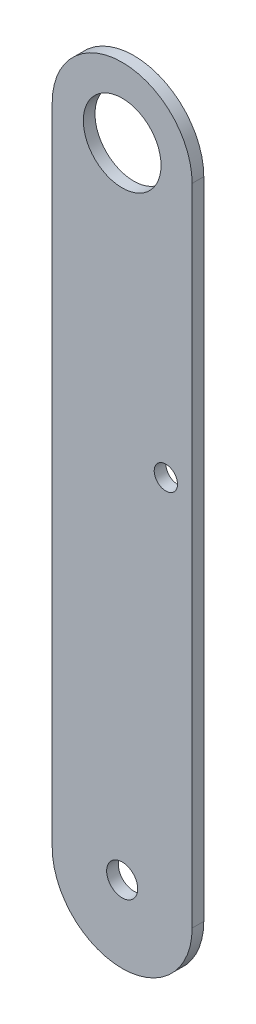
ISO-10303-21;
HEADER;
FILE_DESCRIPTION(('STEP AP214'),'2;1');
FILE_NAME('part.step','',(''),(''),'','','');
FILE_SCHEMA(('AUTOMOTIVE_DESIGN { 1 0 10303 214 1 1 1 1 }'));
ENDSEC;
DATA;
#1=APPLICATION_CONTEXT('core data for automotive mechanical design processes');
#2=APPLICATION_PROTOCOL_DEFINITION('international standard','automotive_design',2000,#1);
#3=PRODUCT_CONTEXT('',#1,'mechanical');
#4=PRODUCT('Part','Part','',(#3));
#5=PRODUCT_RELATED_PRODUCT_CATEGORY('part','',(#4));
#6=PRODUCT_DEFINITION_FORMATION('','',#4);
#7=PRODUCT_DEFINITION_CONTEXT('part definition',#1,'design');
#8=PRODUCT_DEFINITION('design','',#6,#7);
#9=PRODUCT_DEFINITION_SHAPE('','',#8);
#10=(LENGTH_UNIT() NAMED_UNIT(*) SI_UNIT(.MILLI.,.METRE.));
#11=(NAMED_UNIT(*) PLANE_ANGLE_UNIT() SI_UNIT($,.RADIAN.));
#12=(NAMED_UNIT(*) SI_UNIT($,.STERADIAN.) SOLID_ANGLE_UNIT());
#13=UNCERTAINTY_MEASURE_WITH_UNIT(LENGTH_MEASURE(1.E-05),#10,'distance_accuracy_value','');
#14=(GEOMETRIC_REPRESENTATION_CONTEXT(3) GLOBAL_UNCERTAINTY_ASSIGNED_CONTEXT((#13)) GLOBAL_UNIT_ASSIGNED_CONTEXT((#10,
#11,#12)) REPRESENTATION_CONTEXT('',''));
#15=CARTESIAN_POINT('',(0.,0.,0.));
#16=DIRECTION('',(0.,0.,1.));
#17=DIRECTION('',(1.,0.,0.));
#18=AXIS2_PLACEMENT_3D('',#15,#16,#17);
#19=CARTESIAN_POINT('',(-6.54255319148937,34.468085106383,1.5));
#20=DIRECTION('',(0.,0.,-1.));
#21=DIRECTION('',(-1.,0.,0.));
#22=AXIS2_PLACEMENT_3D('',#19,#20,#21);
#23=CYLINDRICAL_SURFACE('',#22,9.);
#24=CARTESIAN_POINT('',(-6.54255319148937,34.468085106383,0.));
#25=DIRECTION('',(0.,0.,1.));
#26=DIRECTION('',(-1.,0.,0.));
#27=AXIS2_PLACEMENT_3D('',#24,#25,#26);
#28=CIRCLE('',#27,9.);
#29=CARTESIAN_POINT('',(2.45744680851063,34.468085106383,0.));
#30=VERTEX_POINT('',#29);
#31=CARTESIAN_POINT('',(-15.5425531914894,34.468085106383,0.));
#32=VERTEX_POINT('',#31);
#33=EDGE_CURVE('E117',#30,#32,#28,.T.);
#34=ORIENTED_EDGE('',*,*,#33,.T.);
#35=DIRECTION('',(0.,0.,-1.));
#36=VECTOR('',#35,1.);
#37=CARTESIAN_POINT('',(-15.5425531914894,34.468085106383,1.5));
#38=LINE('',#37,#36);
#39=CARTESIAN_POINT('',(-15.5425531914894,34.468085106383,1.5));
#40=VERTEX_POINT('',#39);
#41=EDGE_CURVE('E11',#40,#32,#38,.T.);
#42=ORIENTED_EDGE('',*,*,#41,.F.);
#43=CARTESIAN_POINT('',(-6.54255319148937,34.468085106383,1.5));
#44=DIRECTION('',(0.,0.,1.));
#45=DIRECTION('',(-1.,0.,0.));
#46=AXIS2_PLACEMENT_3D('',#43,#44,#45);
#47=CIRCLE('',#46,9.);
#48=CARTESIAN_POINT('',(2.45744680851063,34.468085106383,1.5));
#49=VERTEX_POINT('',#48);
#50=EDGE_CURVE('E101',#49,#40,#47,.T.);
#51=ORIENTED_EDGE('',*,*,#50,.F.);
#52=DIRECTION('',(0.,0.,-1.));
#53=VECTOR('',#52,1.);
#54=CARTESIAN_POINT('',(2.45744680851063,34.468085106383,1.5));
#55=LINE('',#54,#53);
#56=EDGE_CURVE('E113',#49,#30,#55,.T.);
#57=ORIENTED_EDGE('',*,*,#56,.T.);
#58=EDGE_LOOP('',(#34,#42,#51,#57));
#59=FACE_BOUND('',#58,.T.);
#60=ADVANCED_FACE('F49',(#59),#23,.T.);
#61=CARTESIAN_POINT('',(-15.5425531914894,34.468085106383,1.5));
#62=DIRECTION('',(1.,0.,0.));
#63=DIRECTION('',(0.,1.,0.));
#64=AXIS2_PLACEMENT_3D('',#61,#62,#63);
#65=PLANE('',#64);
#66=DIRECTION('',(0.,-1.,0.));
#67=VECTOR('',#66,1.);
#68=CARTESIAN_POINT('',(-15.5425531914894,34.468085106383,0.));
#69=LINE('',#68,#67);
#70=CARTESIAN_POINT('',(-15.5425531914894,-48.5106382978723,0.));
#71=VERTEX_POINT('',#70);
#72=EDGE_CURVE('E106',#32,#71,#69,.T.);
#73=ORIENTED_EDGE('',*,*,#72,.T.);
#74=DIRECTION('',(0.,0.,-1.));
#75=VECTOR('',#74,1.);
#76=CARTESIAN_POINT('',(-15.5425531914894,-48.5106382978723,1.5));
#77=LINE('',#76,#75);
#78=CARTESIAN_POINT('',(-15.5425531914894,-48.5106382978723,1.5));
#79=VERTEX_POINT('',#78);
#80=EDGE_CURVE('E58',#79,#71,#77,.T.);
#81=ORIENTED_EDGE('',*,*,#80,.F.);
#82=DIRECTION('',(0.,-1.,0.));
#83=VECTOR('',#82,1.);
#84=CARTESIAN_POINT('',(-15.5425531914894,34.468085106383,1.5));
#85=LINE('',#84,#83);
#86=EDGE_CURVE('E96',#40,#79,#85,.T.);
#87=ORIENTED_EDGE('',*,*,#86,.F.);
#88=ORIENTED_EDGE('',*,*,#41,.T.);
#89=EDGE_LOOP('',(#73,#81,#87,#88));
#90=FACE_BOUND('',#89,.T.);
#91=ADVANCED_FACE('F105',(#90),#65,.F.);
#92=CARTESIAN_POINT('',(-6.54255319148936,-48.5106382978724,1.5));
#93=DIRECTION('',(0.,0.,-1.));
#94=DIRECTION('',(-1.,0.,0.));
#95=AXIS2_PLACEMENT_3D('',#92,#93,#94);
#96=CYLINDRICAL_SURFACE('',#95,9.);
#97=CARTESIAN_POINT('',(-6.54255319148936,-48.5106382978724,0.));
#98=DIRECTION('',(0.,0.,1.));
#99=DIRECTION('',(1.,0.,0.));
#100=AXIS2_PLACEMENT_3D('',#97,#98,#99);
#101=CIRCLE('',#100,9.);
#102=CARTESIAN_POINT('',(2.45744680851064,-48.5106382978724,0.));
#103=VERTEX_POINT('',#102);
#104=EDGE_CURVE('E83',#71,#103,#101,.T.);
#105=ORIENTED_EDGE('',*,*,#104,.T.);
#106=DIRECTION('',(0.,0.,-1.));
#107=VECTOR('',#106,1.);
#108=CARTESIAN_POINT('',(2.45744680851064,-48.5106382978724,1.5));
#109=LINE('',#108,#107);
#110=CARTESIAN_POINT('',(2.45744680851064,-48.5106382978724,1.5));
#111=VERTEX_POINT('',#110);
#112=EDGE_CURVE('E108',#111,#103,#109,.T.);
#113=ORIENTED_EDGE('',*,*,#112,.F.);
#114=CARTESIAN_POINT('',(-6.54255319148936,-48.5106382978724,1.5));
#115=DIRECTION('',(0.,0.,1.));
#116=DIRECTION('',(1.,0.,0.));
#117=AXIS2_PLACEMENT_3D('',#114,#115,#116);
#118=CIRCLE('',#117,9.);
#119=EDGE_CURVE('E99',#79,#111,#118,.T.);
#120=ORIENTED_EDGE('',*,*,#119,.F.);
#121=ORIENTED_EDGE('',*,*,#80,.T.);
#122=EDGE_LOOP('',(#105,#113,#120,#121));
#123=FACE_BOUND('',#122,.T.);
#124=ADVANCED_FACE('F109',(#123),#96,.T.);
#125=CARTESIAN_POINT('',(2.45744680851063,34.468085106383,1.5));
#126=DIRECTION('',(-1.,0.,0.));
#127=DIRECTION('',(0.,-1.,0.));
#128=AXIS2_PLACEMENT_3D('',#125,#126,#127);
#129=PLANE('',#128);
#130=DIRECTION('',(0.,1.,0.));
#131=VECTOR('',#130,1.);
#132=CARTESIAN_POINT('',(2.45744680851063,34.468085106383,0.));
#133=LINE('',#132,#131);
#134=EDGE_CURVE('E89',#103,#30,#133,.T.);
#135=ORIENTED_EDGE('',*,*,#134,.T.);
#136=ORIENTED_EDGE('',*,*,#56,.F.);
#137=DIRECTION('',(0.,1.,0.));
#138=VECTOR('',#137,1.);
#139=CARTESIAN_POINT('',(2.45744680851063,34.468085106383,1.5));
#140=LINE('',#139,#138);
#141=EDGE_CURVE('E66',#111,#49,#140,.T.);
#142=ORIENTED_EDGE('',*,*,#141,.F.);
#143=ORIENTED_EDGE('',*,*,#112,.T.);
#144=EDGE_LOOP('',(#135,#136,#142,#143));
#145=FACE_BOUND('',#144,.T.);
#146=ADVANCED_FACE('F131',(#145),#129,.F.);
#147=CARTESIAN_POINT('',(-6.54255319148937,34.468085106383,1.5));
#148=DIRECTION('',(0.,0.,-1.));
#149=DIRECTION('',(-1.,0.,0.));
#150=AXIS2_PLACEMENT_3D('',#147,#148,#149);
#151=PLANE('',#150);
#152=CARTESIAN_POINT('',(-6.54255319148937,34.468085106383,1.5));
#153=DIRECTION('',(0.,0.,1.));
#154=DIRECTION('',(1.,0.,0.));
#155=AXIS2_PLACEMENT_3D('',#152,#153,#154);
#156=CIRCLE('',#155,5.);
#157=CARTESIAN_POINT('',(-1.54255319148937,34.468085106383,1.5));
#158=VERTEX_POINT('',#157);
#159=EDGE_CURVE('E154',#158,#158,#156,.T.);
#160=ORIENTED_EDGE('',*,*,#159,.F.);
#161=EDGE_LOOP('',(#160));
#162=FACE_BOUND('',#161,.T.);
#163=CARTESIAN_POINT('',(-0.919972028637972,0.,1.5));
#164=DIRECTION('',(0.,0.,1.));
#165=DIRECTION('',(1.,0.,0.));
#166=AXIS2_PLACEMENT_3D('',#163,#164,#165);
#167=CIRCLE('',#166,1.5);
#168=CARTESIAN_POINT('',(0.580027971362028,0.,1.5));
#169=VERTEX_POINT('',#168);
#170=EDGE_CURVE('E150',#169,#169,#167,.T.);
#171=ORIENTED_EDGE('',*,*,#170,.F.);
#172=EDGE_LOOP('',(#171));
#173=FACE_BOUND('',#172,.T.);
#174=CARTESIAN_POINT('',(-6.54255319148937,-47.6420225479675,1.5));
#175=DIRECTION('',(0.,0.,1.));
#176=DIRECTION('',(1.,0.,0.));
#177=AXIS2_PLACEMENT_3D('',#174,#175,#176);
#178=CIRCLE('',#177,2.);
#179=CARTESIAN_POINT('',(-4.54255319148937,-47.6420225479675,1.5));
#180=VERTEX_POINT('',#179);
#181=EDGE_CURVE('E142',#180,#180,#178,.T.);
#182=ORIENTED_EDGE('',*,*,#181,.F.);
#183=EDGE_LOOP('',(#182));
#184=FACE_BOUND('',#183,.T.);
#185=ORIENTED_EDGE('',*,*,#50,.T.);
#186=ORIENTED_EDGE('',*,*,#86,.T.);
#187=ORIENTED_EDGE('',*,*,#119,.T.);
#188=ORIENTED_EDGE('',*,*,#141,.T.);
#189=EDGE_LOOP('',(#185,#186,#187,#188));
#190=FACE_BOUND('',#189,.T.);
#191=ADVANCED_FACE('F97',(#162,#173,#184,#190),#151,.F.);
#192=CARTESIAN_POINT('',(-6.54255319148937,34.468085106383,0.));
#193=DIRECTION('',(0.,0.,-1.));
#194=DIRECTION('',(-1.,0.,0.));
#195=AXIS2_PLACEMENT_3D('',#192,#193,#194);
#196=PLANE('',#195);
#197=CARTESIAN_POINT('',(-6.54255319148937,34.468085106383,0.));
#198=DIRECTION('',(0.,0.,1.));
#199=DIRECTION('',(1.,0.,0.));
#200=AXIS2_PLACEMENT_3D('',#197,#198,#199);
#201=CIRCLE('',#200,5.);
#202=CARTESIAN_POINT('',(-1.54255319148937,34.468085106383,0.));
#203=VERTEX_POINT('',#202);
#204=EDGE_CURVE('E121',#203,#203,#201,.T.);
#205=ORIENTED_EDGE('',*,*,#204,.T.);
#206=EDGE_LOOP('',(#205));
#207=FACE_BOUND('',#206,.T.);
#208=CARTESIAN_POINT('',(-0.919972028637972,0.,0.));
#209=DIRECTION('',(0.,0.,1.));
#210=DIRECTION('',(1.,0.,0.));
#211=AXIS2_PLACEMENT_3D('',#208,#209,#210);
#212=CIRCLE('',#211,1.5);
#213=CARTESIAN_POINT('',(0.580027971362028,0.,0.));
#214=VERTEX_POINT('',#213);
#215=EDGE_CURVE('E146',#214,#214,#212,.T.);
#216=ORIENTED_EDGE('',*,*,#215,.T.);
#217=EDGE_LOOP('',(#216));
#218=FACE_BOUND('',#217,.T.);
#219=CARTESIAN_POINT('',(-6.54255319148937,-47.6420225479675,0.));
#220=DIRECTION('',(0.,0.,1.));
#221=DIRECTION('',(1.,0.,0.));
#222=AXIS2_PLACEMENT_3D('',#219,#220,#221);
#223=CIRCLE('',#222,2.);
#224=CARTESIAN_POINT('',(-4.54255319148937,-47.6420225479675,0.));
#225=VERTEX_POINT('',#224);
#226=EDGE_CURVE('E138',#225,#225,#223,.T.);
#227=ORIENTED_EDGE('',*,*,#226,.T.);
#228=EDGE_LOOP('',(#227));
#229=FACE_BOUND('',#228,.T.);
#230=ORIENTED_EDGE('',*,*,#33,.F.);
#231=ORIENTED_EDGE('',*,*,#134,.F.);
#232=ORIENTED_EDGE('',*,*,#104,.F.);
#233=ORIENTED_EDGE('',*,*,#72,.F.);
#234=EDGE_LOOP('',(#230,#231,#232,#233));
#235=FACE_BOUND('',#234,.T.);
#236=ADVANCED_FACE('F134',(#207,#218,#229,#235),#196,.T.);
#237=CARTESIAN_POINT('',(-6.54255319148937,-47.6420225479675,0.));
#238=DIRECTION('',(0.,0.,1.));
#239=DIRECTION('',(1.,0.,0.));
#240=AXIS2_PLACEMENT_3D('',#237,#238,#239);
#241=CYLINDRICAL_SURFACE('',#240,2.);
#242=ORIENTED_EDGE('',*,*,#226,.F.);
#243=EDGE_LOOP('',(#242));
#244=FACE_BOUND('',#243,.T.);
#245=ORIENTED_EDGE('',*,*,#181,.T.);
#246=EDGE_LOOP('',(#245));
#247=FACE_BOUND('',#246,.T.);
#248=ADVANCED_FACE('F178',(#244,#247),#241,.F.);
#249=CARTESIAN_POINT('',(-0.919972028637972,0.,0.));
#250=DIRECTION('',(0.,0.,1.));
#251=DIRECTION('',(1.,0.,0.));
#252=AXIS2_PLACEMENT_3D('',#249,#250,#251);
#253=CYLINDRICAL_SURFACE('',#252,1.5);
#254=ORIENTED_EDGE('',*,*,#215,.F.);
#255=EDGE_LOOP('',(#254));
#256=FACE_BOUND('',#255,.T.);
#257=ORIENTED_EDGE('',*,*,#170,.T.);
#258=EDGE_LOOP('',(#257));
#259=FACE_BOUND('',#258,.T.);
#260=ADVANCED_FACE('F167',(#256,#259),#253,.F.);
#261=CARTESIAN_POINT('',(-6.54255319148937,34.468085106383,0.));
#262=DIRECTION('',(0.,0.,1.));
#263=DIRECTION('',(1.,0.,0.));
#264=AXIS2_PLACEMENT_3D('',#261,#262,#263);
#265=CYLINDRICAL_SURFACE('',#264,5.);
#266=ORIENTED_EDGE('',*,*,#204,.F.);
#267=EDGE_LOOP('',(#266));
#268=FACE_BOUND('',#267,.T.);
#269=ORIENTED_EDGE('',*,*,#159,.T.);
#270=EDGE_LOOP('',(#269));
#271=FACE_BOUND('',#270,.T.);
#272=ADVANCED_FACE('F164',(#268,#271),#265,.F.);
#273=CLOSED_SHELL('',(#60,#91,#124,#146,#191,#236,#248,#260,#272));
#274=MANIFOLD_SOLID_BREP('B2',#273);
#275=ADVANCED_BREP_SHAPE_REPRESENTATION('',(#18,#274),#14);
#276=SHAPE_DEFINITION_REPRESENTATION(#9,#275);
ENDSEC;
END-ISO-10303-21;
